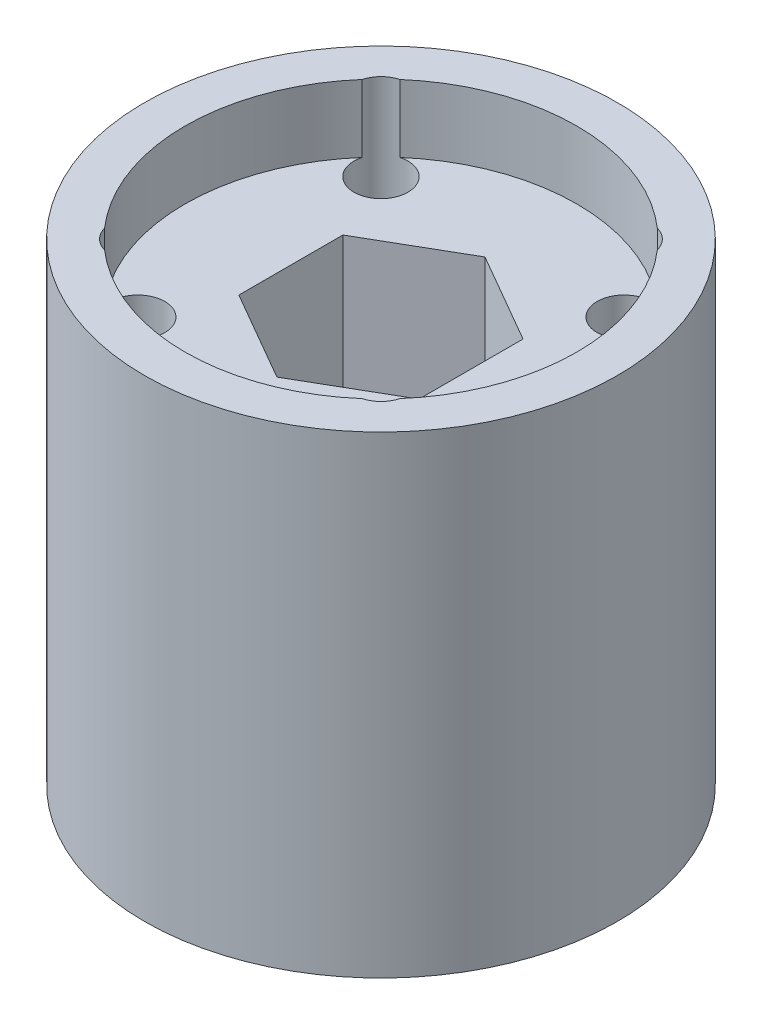
ISO-10303-21;
HEADER;
FILE_DESCRIPTION(('STEP AP214'),'2;1');
FILE_NAME('part.step','',(''),(''),'','','');
FILE_SCHEMA(('AUTOMOTIVE_DESIGN { 1 0 10303 214 1 1 1 1 }'));
ENDSEC;
DATA;
#1=APPLICATION_CONTEXT('core data for automotive mechanical design processes');
#2=APPLICATION_PROTOCOL_DEFINITION('international standard','automotive_design',2000,#1);
#3=PRODUCT_CONTEXT('',#1,'mechanical');
#4=PRODUCT('Part','Part','',(#3));
#5=PRODUCT_RELATED_PRODUCT_CATEGORY('part','',(#4));
#6=PRODUCT_DEFINITION_FORMATION('','',#4);
#7=PRODUCT_DEFINITION_CONTEXT('part definition',#1,'design');
#8=PRODUCT_DEFINITION('design','',#6,#7);
#9=PRODUCT_DEFINITION_SHAPE('','',#8);
#10=(LENGTH_UNIT() NAMED_UNIT(*) SI_UNIT(.MILLI.,.METRE.));
#11=(NAMED_UNIT(*) PLANE_ANGLE_UNIT() SI_UNIT($,.RADIAN.));
#12=(NAMED_UNIT(*) SI_UNIT($,.STERADIAN.) SOLID_ANGLE_UNIT());
#13=UNCERTAINTY_MEASURE_WITH_UNIT(LENGTH_MEASURE(1.E-05),#10,'distance_accuracy_value','');
#14=(GEOMETRIC_REPRESENTATION_CONTEXT(3) GLOBAL_UNCERTAINTY_ASSIGNED_CONTEXT((#13)) GLOBAL_UNIT_ASSIGNED_CONTEXT((#10,
#11,#12)) REPRESENTATION_CONTEXT('',''));
#15=CARTESIAN_POINT('',(0.,0.,0.));
#16=DIRECTION('',(0.,0.,1.));
#17=DIRECTION('',(1.,0.,0.));
#18=AXIS2_PLACEMENT_3D('',#15,#16,#17);
#19=CARTESIAN_POINT('',(6.66839560914018,20.,-3.85));
#20=DIRECTION('',(0.5,0.,-0.866025403784439));
#21=DIRECTION('',(-0.866025403784439,0.,-0.5));
#22=AXIS2_PLACEMENT_3D('',#19,#20,#21);
#23=PLANE('',#22);
#24=DIRECTION('',(0.866025403784439,0.,0.5));
#25=VECTOR('',#24,1.);
#26=CARTESIAN_POINT('',(6.66839560914018,30.,-3.85));
#27=LINE('',#26,#25);
#28=CARTESIAN_POINT('',(0.,30.,-7.70000000000001));
#29=VERTEX_POINT('',#28);
#30=CARTESIAN_POINT('',(6.66839560914018,30.,-3.85));
#31=VERTEX_POINT('',#30);
#32=EDGE_CURVE('E263',#29,#31,#27,.T.);
#33=ORIENTED_EDGE('',*,*,#32,.F.);
#34=DIRECTION('',(0.,1.,0.));
#35=VECTOR('',#34,1.);
#36=CARTESIAN_POINT('',(0.,20.,-7.70000000000001));
#37=LINE('',#36,#35);
#38=CARTESIAN_POINT('',(0.,20.,-7.70000000000001));
#39=VERTEX_POINT('',#38);
#40=EDGE_CURVE('E206',#39,#29,#37,.T.);
#41=ORIENTED_EDGE('',*,*,#40,.F.);
#42=DIRECTION('',(-0.866025403784439,0.,-0.5));
#43=VECTOR('',#42,1.);
#44=CARTESIAN_POINT('',(6.66839560914018,20.,-3.85));
#45=LINE('',#44,#43);
#46=CARTESIAN_POINT('',(6.66839560914018,20.,-3.85));
#47=VERTEX_POINT('',#46);
#48=EDGE_CURVE('E186',#47,#39,#45,.T.);
#49=ORIENTED_EDGE('',*,*,#48,.F.);
#50=DIRECTION('',(0.,1.,0.));
#51=VECTOR('',#50,1.);
#52=CARTESIAN_POINT('',(6.66839560914018,20.,-3.85));
#53=LINE('',#52,#51);
#54=EDGE_CURVE('E207',#47,#31,#53,.T.);
#55=ORIENTED_EDGE('',*,*,#54,.T.);
#56=EDGE_LOOP('',(#33,#41,#49,#55));
#57=FACE_BOUND('',#56,.T.);
#58=ADVANCED_FACE('F34',(#57),#23,.F.);
#59=CARTESIAN_POINT('',(6.66839560914018,20.,3.85));
#60=DIRECTION('',(1.,0.,0.));
#61=DIRECTION('',(0.,0.,-1.));
#62=AXIS2_PLACEMENT_3D('',#59,#60,#61);
#63=PLANE('',#62);
#64=DIRECTION('',(0.,0.,1.));
#65=VECTOR('',#64,1.);
#66=CARTESIAN_POINT('',(6.66839560914018,30.,3.85));
#67=LINE('',#66,#65);
#68=CARTESIAN_POINT('',(6.66839560914018,30.,3.85));
#69=VERTEX_POINT('',#68);
#70=EDGE_CURVE('E261',#31,#69,#67,.T.);
#71=ORIENTED_EDGE('',*,*,#70,.F.);
#72=ORIENTED_EDGE('',*,*,#54,.F.);
#73=DIRECTION('',(0.,0.,-1.));
#74=VECTOR('',#73,1.);
#75=CARTESIAN_POINT('',(6.66839560914018,20.,3.85));
#76=LINE('',#75,#74);
#77=CARTESIAN_POINT('',(6.66839560914018,20.,3.85));
#78=VERTEX_POINT('',#77);
#79=EDGE_CURVE('E203',#78,#47,#76,.T.);
#80=ORIENTED_EDGE('',*,*,#79,.F.);
#81=DIRECTION('',(0.,1.,0.));
#82=VECTOR('',#81,1.);
#83=CARTESIAN_POINT('',(6.66839560914018,20.,3.85));
#84=LINE('',#83,#82);
#85=EDGE_CURVE('E211',#78,#69,#84,.T.);
#86=ORIENTED_EDGE('',*,*,#85,.T.);
#87=EDGE_LOOP('',(#71,#72,#80,#86));
#88=FACE_BOUND('',#87,.T.);
#89=ADVANCED_FACE('F293',(#88),#63,.F.);
#90=CARTESIAN_POINT('',(0.,20.,7.7));
#91=DIRECTION('',(0.5,0.,0.866025403784438));
#92=DIRECTION('',(0.866025403784439,0.,-0.5));
#93=AXIS2_PLACEMENT_3D('',#90,#91,#92);
#94=PLANE('',#93);
#95=DIRECTION('',(-0.866025403784439,0.,0.5));
#96=VECTOR('',#95,1.);
#97=CARTESIAN_POINT('',(0.,30.,7.7));
#98=LINE('',#97,#96);
#99=CARTESIAN_POINT('',(0.,30.,7.7));
#100=VERTEX_POINT('',#99);
#101=EDGE_CURVE('E259',#69,#100,#98,.T.);
#102=ORIENTED_EDGE('',*,*,#101,.F.);
#103=ORIENTED_EDGE('',*,*,#85,.F.);
#104=DIRECTION('',(0.866025403784439,0.,-0.5));
#105=VECTOR('',#104,1.);
#106=CARTESIAN_POINT('',(0.,20.,7.7));
#107=LINE('',#106,#105);
#108=CARTESIAN_POINT('',(0.,20.,7.7));
#109=VERTEX_POINT('',#108);
#110=EDGE_CURVE('E200',#109,#78,#107,.T.);
#111=ORIENTED_EDGE('',*,*,#110,.F.);
#112=DIRECTION('',(0.,1.,0.));
#113=VECTOR('',#112,1.);
#114=CARTESIAN_POINT('',(0.,20.,7.7));
#115=LINE('',#114,#113);
#116=EDGE_CURVE('E214',#109,#100,#115,.T.);
#117=ORIENTED_EDGE('',*,*,#116,.T.);
#118=EDGE_LOOP('',(#102,#103,#111,#117));
#119=FACE_BOUND('',#118,.T.);
#120=ADVANCED_FACE('F299',(#119),#94,.F.);
#121=CARTESIAN_POINT('',(-6.66839560914018,20.,3.85));
#122=DIRECTION('',(-0.5,0.,0.866025403784438));
#123=DIRECTION('',(0.866025403784439,0.,0.5));
#124=AXIS2_PLACEMENT_3D('',#121,#122,#123);
#125=PLANE('',#124);
#126=DIRECTION('',(-0.866025403784439,0.,-0.5));
#127=VECTOR('',#126,1.);
#128=CARTESIAN_POINT('',(-6.66839560914018,30.,3.85));
#129=LINE('',#128,#127);
#130=CARTESIAN_POINT('',(-6.66839560914018,30.,3.85));
#131=VERTEX_POINT('',#130);
#132=EDGE_CURVE('E257',#100,#131,#129,.T.);
#133=ORIENTED_EDGE('',*,*,#132,.F.);
#134=ORIENTED_EDGE('',*,*,#116,.F.);
#135=DIRECTION('',(0.866025403784438,0.,0.5));
#136=VECTOR('',#135,1.);
#137=CARTESIAN_POINT('',(-6.66839560914018,20.,3.85));
#138=LINE('',#137,#136);
#139=CARTESIAN_POINT('',(-6.66839560914018,20.,3.85));
#140=VERTEX_POINT('',#139);
#141=EDGE_CURVE('E197',#140,#109,#138,.T.);
#142=ORIENTED_EDGE('',*,*,#141,.F.);
#143=DIRECTION('',(0.,1.,0.));
#144=VECTOR('',#143,1.);
#145=CARTESIAN_POINT('',(-6.66839560914018,20.,3.85));
#146=LINE('',#145,#144);
#147=EDGE_CURVE('E217',#140,#131,#146,.T.);
#148=ORIENTED_EDGE('',*,*,#147,.T.);
#149=EDGE_LOOP('',(#133,#134,#142,#148));
#150=FACE_BOUND('',#149,.T.);
#151=ADVANCED_FACE('F328',(#150),#125,.F.);
#152=CARTESIAN_POINT('',(-6.66839560914018,20.,-3.85));
#153=DIRECTION('',(-1.,0.,0.));
#154=DIRECTION('',(0.,0.,1.));
#155=AXIS2_PLACEMENT_3D('',#152,#153,#154);
#156=PLANE('',#155);
#157=DIRECTION('',(0.,0.,-1.));
#158=VECTOR('',#157,1.);
#159=CARTESIAN_POINT('',(-6.66839560914018,30.,-3.85));
#160=LINE('',#159,#158);
#161=CARTESIAN_POINT('',(-6.66839560914018,30.,-3.85));
#162=VERTEX_POINT('',#161);
#163=EDGE_CURVE('E49',#131,#162,#160,.T.);
#164=ORIENTED_EDGE('',*,*,#163,.F.);
#165=ORIENTED_EDGE('',*,*,#147,.F.);
#166=DIRECTION('',(0.,0.,1.));
#167=VECTOR('',#166,1.);
#168=CARTESIAN_POINT('',(-6.66839560914018,20.,-3.85));
#169=LINE('',#168,#167);
#170=CARTESIAN_POINT('',(-6.66839560914018,20.,-3.85));
#171=VERTEX_POINT('',#170);
#172=EDGE_CURVE('E194',#171,#140,#169,.T.);
#173=ORIENTED_EDGE('',*,*,#172,.F.);
#174=DIRECTION('',(0.,1.,0.));
#175=VECTOR('',#174,1.);
#176=CARTESIAN_POINT('',(-6.66839560914018,20.,-3.85));
#177=LINE('',#176,#175);
#178=EDGE_CURVE('E220',#171,#162,#177,.T.);
#179=ORIENTED_EDGE('',*,*,#178,.T.);
#180=EDGE_LOOP('',(#164,#165,#173,#179));
#181=FACE_BOUND('',#180,.T.);
#182=ADVANCED_FACE('F331',(#181),#156,.F.);
#183=CARTESIAN_POINT('',(0.,20.,-7.70000000000001));
#184=DIRECTION('',(-0.5,0.,-0.866025403784439));
#185=DIRECTION('',(-0.866025403784439,0.,0.5));
#186=AXIS2_PLACEMENT_3D('',#183,#184,#185);
#187=PLANE('',#186);
#188=DIRECTION('',(0.866025403784439,0.,-0.5));
#189=VECTOR('',#188,1.);
#190=CARTESIAN_POINT('',(0.,30.,-7.70000000000001));
#191=LINE('',#190,#189);
#192=EDGE_CURVE('E254',#162,#29,#191,.T.);
#193=ORIENTED_EDGE('',*,*,#192,.F.);
#194=ORIENTED_EDGE('',*,*,#178,.F.);
#195=DIRECTION('',(-0.866025403784439,0.,0.5));
#196=VECTOR('',#195,1.);
#197=CARTESIAN_POINT('',(0.,20.,-7.70000000000001));
#198=LINE('',#197,#196);
#199=EDGE_CURVE('E191',#39,#171,#198,.T.);
#200=ORIENTED_EDGE('',*,*,#199,.F.);
#201=ORIENTED_EDGE('',*,*,#40,.T.);
#202=EDGE_LOOP('',(#193,#194,#200,#201));
#203=FACE_BOUND('',#202,.T.);
#204=ADVANCED_FACE('F305',(#203),#187,.F.);
#205=CARTESIAN_POINT('',(0.,35.,0.));
#206=DIRECTION('',(0.,-1.,0.));
#207=DIRECTION('',(0.,0.,-1.));
#208=AXIS2_PLACEMENT_3D('',#205,#206,#207);
#209=CYLINDRICAL_SURFACE('',#208,17.5);
#210=CARTESIAN_POINT('',(0.,35.,0.));
#211=DIRECTION('',(0.,1.,0.));
#212=DIRECTION('',(0.,0.,1.));
#213=AXIS2_PLACEMENT_3D('',#210,#211,#212);
#214=CIRCLE('',#213,17.5);
#215=CARTESIAN_POINT('',(0.,35.,17.5));
#216=VERTEX_POINT('',#215);
#217=EDGE_CURVE('E225',#216,#216,#214,.T.);
#218=ORIENTED_EDGE('',*,*,#217,.F.);
#219=EDGE_LOOP('',(#218));
#220=FACE_BOUND('',#219,.T.);
#221=CARTESIAN_POINT('',(0.,0.,0.));
#222=DIRECTION('',(0.,1.,0.));
#223=DIRECTION('',(0.,0.,1.));
#224=AXIS2_PLACEMENT_3D('',#221,#222,#223);
#225=CIRCLE('',#224,17.5);
#226=CARTESIAN_POINT('',(0.,0.,17.5));
#227=VERTEX_POINT('',#226);
#228=EDGE_CURVE('E210',#227,#227,#225,.T.);
#229=ORIENTED_EDGE('',*,*,#228,.T.);
#230=EDGE_LOOP('',(#229));
#231=FACE_BOUND('',#230,.T.);
#232=ADVANCED_FACE('F36',(#220,#231),#209,.T.);
#233=CARTESIAN_POINT('',(0.,35.,0.));
#234=DIRECTION('',(0.,1.,0.));
#235=DIRECTION('',(0.,0.,1.));
#236=AXIS2_PLACEMENT_3D('',#233,#234,#235);
#237=PLANE('',#236);
#238=CARTESIAN_POINT('',(0.,35.,0.));
#239=DIRECTION('',(0.,1.,0.));
#240=DIRECTION('',(0.,0.,1.));
#241=AXIS2_PLACEMENT_3D('',#238,#239,#240);
#242=CIRCLE('',#241,14.5);
#243=CARTESIAN_POINT('',(10.9285587638164,35.,9.52977456951692));
#244=VERTEX_POINT('',#243);
#245=CARTESIAN_POINT('',(10.9285587638164,35.,-9.5297745695169));
#246=VERTEX_POINT('',#245);
#247=EDGE_CURVE('E148',#244,#246,#242,.T.);
#248=ORIENTED_EDGE('',*,*,#247,.F.);
#249=CARTESIAN_POINT('',(9.,35.,9.));
#250=DIRECTION('',(0.,1.,0.));
#251=DIRECTION('',(0.,0.,1.));
#252=AXIS2_PLACEMENT_3D('',#249,#250,#251);
#253=CIRCLE('',#252,2.);
#254=CARTESIAN_POINT('',(9.52977456951692,35.,10.9285587638164));
#255=VERTEX_POINT('',#254);
#256=EDGE_CURVE('E154',#255,#244,#253,.T.);
#257=ORIENTED_EDGE('',*,*,#256,.F.);
#258=CARTESIAN_POINT('',(-9.52977456951692,35.,10.9285587638164));
#259=VERTEX_POINT('',#258);
#260=EDGE_CURVE('E134',#259,#255,#242,.T.);
#261=ORIENTED_EDGE('',*,*,#260,.F.);
#262=CARTESIAN_POINT('',(-9.,35.,9.));
#263=DIRECTION('',(0.,1.,0.));
#264=DIRECTION('',(0.,0.,1.));
#265=AXIS2_PLACEMENT_3D('',#262,#263,#264);
#266=CIRCLE('',#265,2.);
#267=CARTESIAN_POINT('',(-10.9285587638164,35.,9.52977456951692));
#268=VERTEX_POINT('',#267);
#269=EDGE_CURVE('E169',#268,#259,#266,.T.);
#270=ORIENTED_EDGE('',*,*,#269,.F.);
#271=CARTESIAN_POINT('',(-10.9285587638164,35.,-9.5297745695169));
#272=VERTEX_POINT('',#271);
#273=EDGE_CURVE('E146',#272,#268,#242,.T.);
#274=ORIENTED_EDGE('',*,*,#273,.F.);
#275=CARTESIAN_POINT('',(-9.,35.,-9.));
#276=DIRECTION('',(0.,1.,0.));
#277=DIRECTION('',(0.,0.,1.));
#278=AXIS2_PLACEMENT_3D('',#275,#276,#277);
#279=CIRCLE('',#278,2.);
#280=CARTESIAN_POINT('',(-9.5297745695169,35.,-10.9285587638164));
#281=VERTEX_POINT('',#280);
#282=EDGE_CURVE('E179',#281,#272,#279,.T.);
#283=ORIENTED_EDGE('',*,*,#282,.F.);
#284=CARTESIAN_POINT('',(9.5297745695169,35.,-10.9285587638164));
#285=VERTEX_POINT('',#284);
#286=EDGE_CURVE('E240',#285,#281,#242,.T.);
#287=ORIENTED_EDGE('',*,*,#286,.F.);
#288=CARTESIAN_POINT('',(9.,35.,-9.));
#289=DIRECTION('',(0.,1.,0.));
#290=DIRECTION('',(0.,0.,1.));
#291=AXIS2_PLACEMENT_3D('',#288,#289,#290);
#292=CIRCLE('',#291,2.);
#293=EDGE_CURVE('E166',#246,#285,#292,.T.);
#294=ORIENTED_EDGE('',*,*,#293,.F.);
#295=EDGE_LOOP('',(#248,#257,#261,#270,#274,#283,#287,#294));
#296=FACE_BOUND('',#295,.T.);
#297=ORIENTED_EDGE('',*,*,#217,.T.);
#298=EDGE_LOOP('',(#297));
#299=FACE_BOUND('',#298,.T.);
#300=ADVANCED_FACE('F159',(#296,#299),#237,.T.);
#301=CARTESIAN_POINT('',(0.,0.,0.));
#302=DIRECTION('',(0.,1.,0.));
#303=DIRECTION('',(0.,0.,1.));
#304=AXIS2_PLACEMENT_3D('',#301,#302,#303);
#305=PLANE('',#304);
#306=CARTESIAN_POINT('',(9.,0.,-9.));
#307=DIRECTION('',(0.,1.,0.));
#308=DIRECTION('',(0.,0.,1.));
#309=AXIS2_PLACEMENT_3D('',#306,#307,#308);
#310=CIRCLE('',#309,2.);
#311=CARTESIAN_POINT('',(9.,0.,-7.));
#312=VERTEX_POINT('',#311);
#313=EDGE_CURVE('E182',#312,#312,#310,.T.);
#314=ORIENTED_EDGE('',*,*,#313,.T.);
#315=EDGE_LOOP('',(#314));
#316=FACE_BOUND('',#315,.T.);
#317=CARTESIAN_POINT('',(9.,0.,9.));
#318=DIRECTION('',(0.,1.,0.));
#319=DIRECTION('',(0.,0.,1.));
#320=AXIS2_PLACEMENT_3D('',#317,#318,#319);
#321=CIRCLE('',#320,2.);
#322=CARTESIAN_POINT('',(9.,0.,11.));
#323=VERTEX_POINT('',#322);
#324=EDGE_CURVE('E162',#323,#323,#321,.T.);
#325=ORIENTED_EDGE('',*,*,#324,.T.);
#326=EDGE_LOOP('',(#325));
#327=FACE_BOUND('',#326,.T.);
#328=CARTESIAN_POINT('',(-9.,0.,9.));
#329=DIRECTION('',(0.,1.,0.));
#330=DIRECTION('',(0.,0.,1.));
#331=AXIS2_PLACEMENT_3D('',#328,#329,#330);
#332=CIRCLE('',#331,2.);
#333=CARTESIAN_POINT('',(-9.,0.,11.));
#334=VERTEX_POINT('',#333);
#335=EDGE_CURVE('E163',#334,#334,#332,.T.);
#336=ORIENTED_EDGE('',*,*,#335,.T.);
#337=EDGE_LOOP('',(#336));
#338=FACE_BOUND('',#337,.T.);
#339=CARTESIAN_POINT('',(-9.,0.,-9.));
#340=DIRECTION('',(0.,1.,0.));
#341=DIRECTION('',(0.,0.,1.));
#342=AXIS2_PLACEMENT_3D('',#339,#340,#341);
#343=CIRCLE('',#342,2.);
#344=CARTESIAN_POINT('',(-9.,0.,-7.));
#345=VERTEX_POINT('',#344);
#346=EDGE_CURVE('E175',#345,#345,#343,.T.);
#347=ORIENTED_EDGE('',*,*,#346,.T.);
#348=EDGE_LOOP('',(#347));
#349=FACE_BOUND('',#348,.T.);
#350=CARTESIAN_POINT('',(0.,0.,0.));
#351=DIRECTION('',(0.,1.,0.));
#352=DIRECTION('',(0.,0.,1.));
#353=AXIS2_PLACEMENT_3D('',#350,#351,#352);
#354=CIRCLE('',#353,4.1);
#355=CARTESIAN_POINT('',(0.,0.,4.1));
#356=VERTEX_POINT('',#355);
#357=EDGE_CURVE('E183',#356,#356,#354,.T.);
#358=ORIENTED_EDGE('',*,*,#357,.T.);
#359=EDGE_LOOP('',(#358));
#360=FACE_BOUND('',#359,.T.);
#361=ORIENTED_EDGE('',*,*,#228,.F.);
#362=EDGE_LOOP('',(#361));
#363=FACE_BOUND('',#362,.T.);
#364=ADVANCED_FACE('F277',(#316,#327,#338,#349,#360,#363),#305,.F.);
#365=CARTESIAN_POINT('',(0.,20.,0.));
#366=DIRECTION('',(0.,1.,0.));
#367=DIRECTION('',(0.,0.,1.));
#368=AXIS2_PLACEMENT_3D('',#365,#366,#367);
#369=PLANE('',#368);
#370=CARTESIAN_POINT('',(0.,20.,0.));
#371=DIRECTION('',(0.,1.,0.));
#372=DIRECTION('',(0.,0.,1.));
#373=AXIS2_PLACEMENT_3D('',#370,#371,#372);
#374=CIRCLE('',#373,4.1);
#375=CARTESIAN_POINT('',(0.,20.,4.1));
#376=VERTEX_POINT('',#375);
#377=EDGE_CURVE('E178',#376,#376,#374,.T.);
#378=ORIENTED_EDGE('',*,*,#377,.F.);
#379=EDGE_LOOP('',(#378));
#380=FACE_BOUND('',#379,.T.);
#381=ORIENTED_EDGE('',*,*,#48,.T.);
#382=ORIENTED_EDGE('',*,*,#199,.T.);
#383=ORIENTED_EDGE('',*,*,#172,.T.);
#384=ORIENTED_EDGE('',*,*,#141,.T.);
#385=ORIENTED_EDGE('',*,*,#110,.T.);
#386=ORIENTED_EDGE('',*,*,#79,.T.);
#387=EDGE_LOOP('',(#381,#382,#383,#384,#385,#386));
#388=FACE_BOUND('',#387,.T.);
#389=ADVANCED_FACE('F309',(#380,#388),#369,.T.);
#390=CARTESIAN_POINT('',(0.,0.,0.));
#391=DIRECTION('',(0.,1.,0.));
#392=DIRECTION('',(0.,0.,1.));
#393=AXIS2_PLACEMENT_3D('',#390,#391,#392);
#394=CYLINDRICAL_SURFACE('',#393,4.1);
#395=ORIENTED_EDGE('',*,*,#357,.F.);
#396=EDGE_LOOP('',(#395));
#397=FACE_BOUND('',#396,.T.);
#398=ORIENTED_EDGE('',*,*,#377,.T.);
#399=EDGE_LOOP('',(#398));
#400=FACE_BOUND('',#399,.T.);
#401=ADVANCED_FACE('F313',(#397,#400),#394,.F.);
#402=CARTESIAN_POINT('',(-9.,0.,-9.));
#403=DIRECTION('',(0.,1.,0.));
#404=DIRECTION('',(0.,0.,1.));
#405=AXIS2_PLACEMENT_3D('',#402,#403,#404);
#406=CYLINDRICAL_SURFACE('',#405,2.);
#407=ORIENTED_EDGE('',*,*,#346,.F.);
#408=EDGE_LOOP('',(#407));
#409=FACE_BOUND('',#408,.T.);
#410=CARTESIAN_POINT('',(-9.,30.,-9.));
#411=DIRECTION('',(0.,1.,0.));
#412=DIRECTION('',(0.,0.,1.));
#413=AXIS2_PLACEMENT_3D('',#410,#411,#412);
#414=CIRCLE('',#413,2.);
#415=CARTESIAN_POINT('',(-9.5297745695169,30.,-10.9285587638164));
#416=VERTEX_POINT('',#415);
#417=CARTESIAN_POINT('',(-10.9285587638164,30.,-9.5297745695169));
#418=VERTEX_POINT('',#417);
#419=EDGE_CURVE('E252',#416,#418,#414,.F.);
#420=ORIENTED_EDGE('',*,*,#419,.F.);
#421=DIRECTION('',(0.,1.,0.));
#422=VECTOR('',#421,1.);
#423=CARTESIAN_POINT('',(-9.52977456951691,32.5,-10.9285587638164));
#424=LINE('',#423,#422);
#425=EDGE_CURVE('E174',#416,#281,#424,.T.);
#426=ORIENTED_EDGE('',*,*,#425,.T.);
#427=ORIENTED_EDGE('',*,*,#282,.T.);
#428=DIRECTION('',(0.,1.,0.));
#429=VECTOR('',#428,1.);
#430=CARTESIAN_POINT('',(-10.9285587638164,32.5,-9.52977456951691));
#431=LINE('',#430,#429);
#432=EDGE_CURVE('E270',#272,#418,#431,.F.);
#433=ORIENTED_EDGE('',*,*,#432,.T.);
#434=EDGE_LOOP('',(#420,#426,#427,#433));
#435=FACE_BOUND('',#434,.T.);
#436=ADVANCED_FACE('F319',(#409,#435),#406,.F.);
#437=CARTESIAN_POINT('',(-9.,0.,9.));
#438=DIRECTION('',(0.,1.,0.));
#439=DIRECTION('',(0.,0.,1.));
#440=AXIS2_PLACEMENT_3D('',#437,#438,#439);
#441=CYLINDRICAL_SURFACE('',#440,2.);
#442=ORIENTED_EDGE('',*,*,#335,.F.);
#443=EDGE_LOOP('',(#442));
#444=FACE_BOUND('',#443,.T.);
#445=CARTESIAN_POINT('',(-9.,30.,9.));
#446=DIRECTION('',(0.,1.,0.));
#447=DIRECTION('',(0.,0.,1.));
#448=AXIS2_PLACEMENT_3D('',#445,#446,#447);
#449=CIRCLE('',#448,2.);
#450=CARTESIAN_POINT('',(-10.9285587638164,30.,9.52977456951692));
#451=VERTEX_POINT('',#450);
#452=CARTESIAN_POINT('',(-9.52977456951692,30.,10.9285587638164));
#453=VERTEX_POINT('',#452);
#454=EDGE_CURVE('E250',#451,#453,#449,.F.);
#455=ORIENTED_EDGE('',*,*,#454,.F.);
#456=DIRECTION('',(0.,1.,0.));
#457=VECTOR('',#456,1.);
#458=CARTESIAN_POINT('',(-10.9285587638164,32.5,9.52977456951691));
#459=LINE('',#458,#457);
#460=EDGE_CURVE('E267',#451,#268,#459,.T.);
#461=ORIENTED_EDGE('',*,*,#460,.T.);
#462=ORIENTED_EDGE('',*,*,#269,.T.);
#463=DIRECTION('',(0.,1.,0.));
#464=VECTOR('',#463,1.);
#465=CARTESIAN_POINT('',(-9.5297745695169,32.5,10.9285587638164));
#466=LINE('',#465,#464);
#467=EDGE_CURVE('E141',#259,#453,#466,.F.);
#468=ORIENTED_EDGE('',*,*,#467,.T.);
#469=EDGE_LOOP('',(#455,#461,#462,#468));
#470=FACE_BOUND('',#469,.T.);
#471=ADVANCED_FACE('F289',(#444,#470),#441,.F.);
#472=CARTESIAN_POINT('',(9.,0.,9.));
#473=DIRECTION('',(0.,1.,0.));
#474=DIRECTION('',(0.,0.,1.));
#475=AXIS2_PLACEMENT_3D('',#472,#473,#474);
#476=CYLINDRICAL_SURFACE('',#475,2.);
#477=ORIENTED_EDGE('',*,*,#324,.F.);
#478=EDGE_LOOP('',(#477));
#479=FACE_BOUND('',#478,.T.);
#480=CARTESIAN_POINT('',(9.,30.,9.));
#481=DIRECTION('',(0.,1.,0.));
#482=DIRECTION('',(0.,0.,1.));
#483=AXIS2_PLACEMENT_3D('',#480,#481,#482);
#484=CIRCLE('',#483,2.);
#485=CARTESIAN_POINT('',(9.52977456951692,30.,10.9285587638164));
#486=VERTEX_POINT('',#485);
#487=CARTESIAN_POINT('',(10.9285587638164,30.,9.52977456951692));
#488=VERTEX_POINT('',#487);
#489=EDGE_CURVE('E155',#486,#488,#484,.F.);
#490=ORIENTED_EDGE('',*,*,#489,.F.);
#491=DIRECTION('',(0.,1.,0.));
#492=VECTOR('',#491,1.);
#493=CARTESIAN_POINT('',(9.52977456951691,32.5,10.9285587638164));
#494=LINE('',#493,#492);
#495=EDGE_CURVE('E138',#486,#255,#494,.T.);
#496=ORIENTED_EDGE('',*,*,#495,.T.);
#497=ORIENTED_EDGE('',*,*,#256,.T.);
#498=DIRECTION('',(0.,1.,0.));
#499=VECTOR('',#498,1.);
#500=CARTESIAN_POINT('',(10.9285587638164,32.5,9.52977456951691));
#501=LINE('',#500,#499);
#502=EDGE_CURVE('E156',#244,#488,#501,.F.);
#503=ORIENTED_EDGE('',*,*,#502,.T.);
#504=EDGE_LOOP('',(#490,#496,#497,#503));
#505=FACE_BOUND('',#504,.T.);
#506=ADVANCED_FACE('F152',(#479,#505),#476,.F.);
#507=CARTESIAN_POINT('',(9.,0.,-9.));
#508=DIRECTION('',(0.,1.,0.));
#509=DIRECTION('',(0.,0.,1.));
#510=AXIS2_PLACEMENT_3D('',#507,#508,#509);
#511=CYLINDRICAL_SURFACE('',#510,2.);
#512=ORIENTED_EDGE('',*,*,#313,.F.);
#513=EDGE_LOOP('',(#512));
#514=FACE_BOUND('',#513,.T.);
#515=CARTESIAN_POINT('',(9.,30.,-9.));
#516=DIRECTION('',(0.,1.,0.));
#517=DIRECTION('',(0.,0.,1.));
#518=AXIS2_PLACEMENT_3D('',#515,#516,#517);
#519=CIRCLE('',#518,2.);
#520=CARTESIAN_POINT('',(10.9285587638164,30.,-9.5297745695169));
#521=VERTEX_POINT('',#520);
#522=CARTESIAN_POINT('',(9.5297745695169,30.,-10.9285587638164));
#523=VERTEX_POINT('',#522);
#524=EDGE_CURVE('E228',#521,#523,#519,.F.);
#525=ORIENTED_EDGE('',*,*,#524,.F.);
#526=DIRECTION('',(0.,1.,0.));
#527=VECTOR('',#526,1.);
#528=CARTESIAN_POINT('',(10.9285587638164,32.5,-9.52977456951691));
#529=LINE('',#528,#527);
#530=EDGE_CURVE('E11',#521,#246,#529,.T.);
#531=ORIENTED_EDGE('',*,*,#530,.T.);
#532=ORIENTED_EDGE('',*,*,#293,.T.);
#533=DIRECTION('',(0.,1.,0.));
#534=VECTOR('',#533,1.);
#535=CARTESIAN_POINT('',(9.52977456951691,32.5,-10.9285587638164));
#536=LINE('',#535,#534);
#537=EDGE_CURVE('E42',#285,#523,#536,.F.);
#538=ORIENTED_EDGE('',*,*,#537,.T.);
#539=EDGE_LOOP('',(#525,#531,#532,#538));
#540=FACE_BOUND('',#539,.T.);
#541=ADVANCED_FACE('F235',(#514,#540),#511,.F.);
#542=CARTESIAN_POINT('',(0.,30.,0.));
#543=DIRECTION('',(0.,1.,0.));
#544=DIRECTION('',(0.,0.,1.));
#545=AXIS2_PLACEMENT_3D('',#542,#543,#544);
#546=CYLINDRICAL_SURFACE('',#545,14.5);
#547=CARTESIAN_POINT('',(0.,30.,0.));
#548=DIRECTION('',(0.,1.,0.));
#549=DIRECTION('',(0.,0.,1.));
#550=AXIS2_PLACEMENT_3D('',#547,#548,#549);
#551=CIRCLE('',#550,14.5);
#552=EDGE_CURVE('E243',#523,#416,#551,.T.);
#553=ORIENTED_EDGE('',*,*,#552,.F.);
#554=ORIENTED_EDGE('',*,*,#537,.F.);
#555=ORIENTED_EDGE('',*,*,#286,.T.);
#556=ORIENTED_EDGE('',*,*,#425,.F.);
#557=EDGE_LOOP('',(#553,#554,#555,#556));
#558=FACE_BOUND('',#557,.T.);
#559=ADVANCED_FACE('F239',(#558),#546,.F.);
#560=ORIENTED_EDGE('',*,*,#273,.T.);
#561=ORIENTED_EDGE('',*,*,#460,.F.);
#562=EDGE_CURVE('E358',#418,#451,#551,.T.);
#563=ORIENTED_EDGE('',*,*,#562,.F.);
#564=ORIENTED_EDGE('',*,*,#432,.F.);
#565=EDGE_LOOP('',(#560,#561,#563,#564));
#566=FACE_BOUND('',#565,.T.);
#567=ADVANCED_FACE('F286',(#566),#546,.F.);
#568=ORIENTED_EDGE('',*,*,#260,.T.);
#569=ORIENTED_EDGE('',*,*,#495,.F.);
#570=EDGE_CURVE('E246',#453,#486,#551,.T.);
#571=ORIENTED_EDGE('',*,*,#570,.F.);
#572=ORIENTED_EDGE('',*,*,#467,.F.);
#573=EDGE_LOOP('',(#568,#569,#571,#572));
#574=FACE_BOUND('',#573,.T.);
#575=ADVANCED_FACE('F136',(#574),#546,.F.);
#576=ORIENTED_EDGE('',*,*,#247,.T.);
#577=ORIENTED_EDGE('',*,*,#530,.F.);
#578=EDGE_CURVE('E57',#488,#521,#551,.T.);
#579=ORIENTED_EDGE('',*,*,#578,.F.);
#580=ORIENTED_EDGE('',*,*,#502,.F.);
#581=EDGE_LOOP('',(#576,#577,#579,#580));
#582=FACE_BOUND('',#581,.T.);
#583=ADVANCED_FACE('F288',(#582),#546,.F.);
#584=CARTESIAN_POINT('',(0.,30.,0.));
#585=DIRECTION('',(0.,1.,0.));
#586=DIRECTION('',(0.,0.,1.));
#587=AXIS2_PLACEMENT_3D('',#584,#585,#586);
#588=PLANE('',#587);
#589=ORIENTED_EDGE('',*,*,#419,.T.);
#590=ORIENTED_EDGE('',*,*,#562,.T.);
#591=ORIENTED_EDGE('',*,*,#454,.T.);
#592=ORIENTED_EDGE('',*,*,#570,.T.);
#593=ORIENTED_EDGE('',*,*,#489,.T.);
#594=ORIENTED_EDGE('',*,*,#578,.T.);
#595=ORIENTED_EDGE('',*,*,#524,.T.);
#596=ORIENTED_EDGE('',*,*,#552,.T.);
#597=EDGE_LOOP('',(#589,#590,#591,#592,#593,#594,#595,#596));
#598=FACE_BOUND('',#597,.T.);
#599=ORIENTED_EDGE('',*,*,#32,.T.);
#600=ORIENTED_EDGE('',*,*,#70,.T.);
#601=ORIENTED_EDGE('',*,*,#101,.T.);
#602=ORIENTED_EDGE('',*,*,#132,.T.);
#603=ORIENTED_EDGE('',*,*,#163,.T.);
#604=ORIENTED_EDGE('',*,*,#192,.T.);
#605=EDGE_LOOP('',(#599,#600,#601,#602,#603,#604));
#606=FACE_BOUND('',#605,.T.);
#607=ADVANCED_FACE('F345',(#598,#606),#588,.T.);
#608=CLOSED_SHELL('',(#58,#89,#120,#151,#182,#204,#232,#300,#364,#389,#401,#436,#471,#506,#541,
#559,#567,#575,#583,#607));
#609=MANIFOLD_SOLID_BREP('B2',#608);
#610=ADVANCED_BREP_SHAPE_REPRESENTATION('',(#18,#609),#14);
#611=SHAPE_DEFINITION_REPRESENTATION(#9,#610);
ENDSEC;
END-ISO-10303-21;
